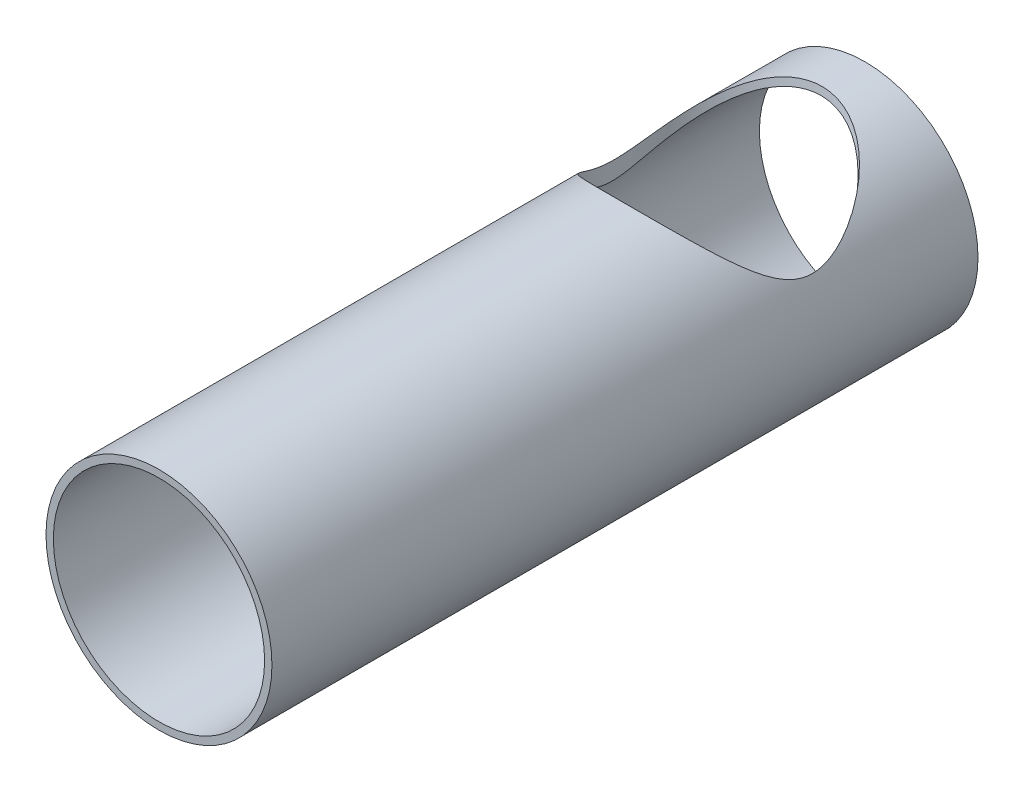
ISO-10303-21;
HEADER;
FILE_DESCRIPTION(('STEP AP214'),'2;1');
FILE_NAME('part.step','',(''),(''),'','','');
FILE_SCHEMA(('AUTOMOTIVE_DESIGN { 1 0 10303 214 1 1 1 1 }'));
ENDSEC;
DATA;
#1=APPLICATION_CONTEXT('core data for automotive mechanical design processes');
#2=APPLICATION_PROTOCOL_DEFINITION('international standard','automotive_design',2000,#1);
#3=PRODUCT_CONTEXT('',#1,'mechanical');
#4=PRODUCT('Part','Part','',(#3));
#5=PRODUCT_RELATED_PRODUCT_CATEGORY('part','',(#4));
#6=PRODUCT_DEFINITION_FORMATION('','',#4);
#7=PRODUCT_DEFINITION_CONTEXT('part definition',#1,'design');
#8=PRODUCT_DEFINITION('design','',#6,#7);
#9=PRODUCT_DEFINITION_SHAPE('','',#8);
#10=(LENGTH_UNIT() NAMED_UNIT(*) SI_UNIT(.MILLI.,.METRE.));
#11=(NAMED_UNIT(*) PLANE_ANGLE_UNIT() SI_UNIT($,.RADIAN.));
#12=(NAMED_UNIT(*) SI_UNIT($,.STERADIAN.) SOLID_ANGLE_UNIT());
#13=UNCERTAINTY_MEASURE_WITH_UNIT(LENGTH_MEASURE(1.E-05),#10,'distance_accuracy_value','');
#14=(GEOMETRIC_REPRESENTATION_CONTEXT(3) GLOBAL_UNCERTAINTY_ASSIGNED_CONTEXT((#13)) GLOBAL_UNIT_ASSIGNED_CONTEXT((#10,
#11,#12)) REPRESENTATION_CONTEXT('',''));
#15=CARTESIAN_POINT('',(0.,0.,0.));
#16=DIRECTION('',(0.,0.,1.));
#17=DIRECTION('',(1.,0.,0.));
#18=AXIS2_PLACEMENT_3D('',#15,#16,#17);
#19=CARTESIAN_POINT('',(0.,0.,158.75));
#20=DIRECTION('',(0.,0.,-1.));
#21=DIRECTION('',(-1.,0.,0.));
#22=AXIS2_PLACEMENT_3D('',#19,#20,#21);
#23=CYLINDRICAL_SURFACE('',#22,25.4);
#24=CARTESIAN_POINT('',(0.,0.,0.));
#25=DIRECTION('',(0.,0.,1.));
#26=DIRECTION('',(1.,0.,0.));
#27=AXIS2_PLACEMENT_3D('',#24,#25,#26);
#28=CIRCLE('',#27,25.4);
#29=CARTESIAN_POINT('',(25.4,0.,0.));
#30=VERTEX_POINT('',#29);
#31=EDGE_CURVE('E43',#30,#30,#28,.T.);
#32=ORIENTED_EDGE('',*,*,#31,.T.);
#33=EDGE_LOOP('',(#32));
#34=FACE_BOUND('',#33,.T.);
#35=CARTESIAN_POINT('',(0.,0.,158.75));
#36=DIRECTION('',(0.,0.,1.));
#37=DIRECTION('',(1.,0.,0.));
#38=AXIS2_PLACEMENT_3D('',#35,#36,#37);
#39=CIRCLE('',#38,25.4);
#40=CARTESIAN_POINT('',(25.4,0.,158.75));
#41=VERTEX_POINT('',#40);
#42=EDGE_CURVE('E10',#41,#41,#39,.T.);
#43=ORIENTED_EDGE('',*,*,#42,.F.);
#44=EDGE_LOOP('',(#43));
#45=FACE_BOUND('',#44,.T.);
#46=CARTESIAN_POINT('',(0.,25.4,54.5744532514627));
#47=CARTESIAN_POINT('',(0.543044109101492,25.3999985133409,54.5744519809982));
#48=CARTESIAN_POINT('',(1.08610934257235,25.3825532916884,54.5569065396016));
#49=CARTESIAN_POINT('',(2.16777710877893,25.3131291967407,54.4870082437825));
#50=CARTESIAN_POINT('',(2.70637939730243,25.2611484461329,54.434653497165));
#51=CARTESIAN_POINT('',(3.77507043033819,25.1236787183286,54.2959414756275));
#52=CARTESIAN_POINT('',(4.30515542950266,25.0381753983664,54.20956964629));
#53=CARTESIAN_POINT('',(5.35270281553756,24.8353223145373,54.0041222177252));
#54=CARTESIAN_POINT('',(5.87016521587325,24.7179725846446,53.8850466533866));
#55=CARTESIAN_POINT('',(6.88663391169063,24.4542155125313,53.6164904050943));
#56=CARTESIAN_POINT('',(7.38571804531323,24.3079529810863,53.4671611585642));
#57=CARTESIAN_POINT('',(8.36535843216009,23.9884608588766,53.1395592621605));
#58=CARTESIAN_POINT('',(8.84591471316594,23.8152313085496,52.9612866556882));
#59=CARTESIAN_POINT('',(9.78628178414864,23.4444899527841,52.5777132945053));
#60=CARTESIAN_POINT('',(10.2460956978944,23.2469818204638,52.3724166279455));
#61=CARTESIAN_POINT('',(11.143489004118,22.8304059775863,51.9365916911342));
#62=CARTESIAN_POINT('',(11.5810652465446,22.6113352254379,51.706059860732));
#63=CARTESIAN_POINT('',(12.4684379701758,22.1353186210106,51.2011863446624));
#64=CARTESIAN_POINT('',(12.9161881286465,21.8767372938388,50.924792498912));
#65=CARTESIAN_POINT('',(13.7831165418681,21.3411655950838,50.3462908457317));
#66=CARTESIAN_POINT('',(14.2022932095722,21.0641742026422,50.0441816120938));
#67=CARTESIAN_POINT('',(15.0119876406164,20.4950100389392,49.4153434994483));
#68=CARTESIAN_POINT('',(15.4024646851071,20.2028166654257,49.0885809245727));
#69=CARTESIAN_POINT('',(16.1537378938829,19.6073086647606,48.4118729915013));
#70=CARTESIAN_POINT('',(16.5145312828302,19.3039930015305,48.0619254710881));
#71=CARTESIAN_POINT('',(17.2766383683602,18.627599270138,47.265796824965));
#72=CARTESIAN_POINT('',(17.6712242140263,18.2529019422212,46.8145383992333));
#73=CARTESIAN_POINT('',(18.4166112361073,17.5005333109247,45.8789562213728));
#74=CARTESIAN_POINT('',(18.7673939472977,17.1228608242066,45.3946186569199));
#75=CARTESIAN_POINT('',(19.2596376098131,16.5616542656886,44.64267892329));
#76=CARTESIAN_POINT('',(19.4179985242925,16.3755537339444,44.3879168223579));
#77=CARTESIAN_POINT('',(19.7233218961993,16.0064943136974,43.8694616832648));
#78=CARTESIAN_POINT('',(19.8702857239152,15.8235350495814,43.6057697242479));
#79=CARTESIAN_POINT('',(20.1524655829059,15.4625541571574,43.0692310549454));
#80=CARTESIAN_POINT('',(20.2876906381353,15.284528808968,42.7963916043501));
#81=CARTESIAN_POINT('',(20.5461987853985,14.9352242434897,42.2408295575968));
#82=CARTESIAN_POINT('',(20.66948036001,14.7639458850438,41.9581057118174));
#83=CARTESIAN_POINT('',(20.9094497194313,14.4222267731328,41.3679719009154));
#84=CARTESIAN_POINT('',(21.025505462248,14.252250545377,41.0600333553242));
#85=CARTESIAN_POINT('',(21.2432210111938,13.9256621225521,40.4322923641351));
#86=CARTESIAN_POINT('',(21.3448857139376,13.7690453890992,40.1124940008583));
#87=CARTESIAN_POINT('',(21.5328290768842,13.4732301104542,39.4612908574595));
#88=CARTESIAN_POINT('',(21.6191376415331,13.3339978721466,39.1299101732045));
#89=CARTESIAN_POINT('',(21.7756153718284,13.0768978130998,38.4552099674225));
#90=CARTESIAN_POINT('',(21.8457873004516,12.9590263356227,38.1118925013637));
#91=CARTESIAN_POINT('',(21.9600634904851,12.7642654197161,37.4649018836385));
#92=CARTESIAN_POINT('',(22.0064705700553,12.6839137730788,37.1626815747364));
#93=CARTESIAN_POINT('',(22.086189864736,12.5445878830835,36.5516410210607));
#94=CARTESIAN_POINT('',(22.1195036757322,12.485611034506,36.2428215854689));
#95=CARTESIAN_POINT('',(22.1726679039566,12.3909549808955,35.6207289920115));
#96=CARTESIAN_POINT('',(22.1925295444454,12.3552563555704,35.3074597700087));
#97=CARTESIAN_POINT('',(22.2187884652799,12.3079719974785,34.6785413426079));
#98=CARTESIAN_POINT('',(22.2251854740243,12.2963867511137,34.3628920893302));
#99=CARTESIAN_POINT('',(22.2248067805522,12.2970714959609,33.7323981574621));
#100=CARTESIAN_POINT('',(22.218062469653,12.3092846387918,33.4175533560208));
#101=CARTESIAN_POINT('',(22.1920571988063,12.3561014531808,32.7901321517456));
#102=CARTESIAN_POINT('',(22.1727959141004,12.390705705686,32.4775558079806));
#103=CARTESIAN_POINT('',(22.0972878640051,12.5252064891459,31.5449466108873));
#104=CARTESIAN_POINT('',(22.0233197961139,12.6557837229783,30.9306192152068));
#105=CARTESIAN_POINT('',(21.8464040422192,12.958431158362,29.7999150513748));
#106=CARTESIAN_POINT('',(21.7481289962745,13.1234392546633,29.2807722398914));
#107=CARTESIAN_POINT('',(21.5237887538079,13.4882336413847,28.2607267321913));
#108=CARTESIAN_POINT('',(21.3977012476416,13.6880478241416,27.7598390572435));
#109=CARTESIAN_POINT('',(21.1196532288719,14.1132933198003,26.7741335701296));
#110=CARTESIAN_POINT('',(20.9675905114746,14.3388246094617,26.2893886417198));
#111=CARTESIAN_POINT('',(20.639472055829,14.8072273453193,25.336892422366));
#112=CARTESIAN_POINT('',(20.4634203625306,15.0500958648831,24.8691382832909));
#113=CARTESIAN_POINT('',(20.1185531463052,15.50716096383,24.0240624517841));
#114=CARTESIAN_POINT('',(19.95319320518,15.7196209815872,23.6443757023676));
#115=CARTESIAN_POINT('',(19.6063680950472,16.1501312884571,22.8956172240495));
#116=CARTESIAN_POINT('',(19.4249011394183,16.3681821958097,22.5265466787448));
#117=CARTESIAN_POINT('',(19.045802306339,16.8077876685647,21.7985894390365));
#118=CARTESIAN_POINT('',(18.8481607381445,17.0293442692734,21.4397090258778));
#119=CARTESIAN_POINT('',(18.4367199643381,17.4739551527015,20.7323164468985));
#120=CARTESIAN_POINT('',(18.2229214222974,17.6970093735708,20.3838038560871));
#121=CARTESIAN_POINT('',(17.7793210514847,18.1426130735272,19.6978168221308));
#122=CARTESIAN_POINT('',(17.5495462289052,18.3651627779138,19.3603251038003));
#123=CARTESIAN_POINT('',(17.0734426227854,18.808600052613,18.6961413289575));
#124=CARTESIAN_POINT('',(16.8271132985773,19.0294875683764,18.3694496256925));
#125=CARTESIAN_POINT('',(16.0630849584716,19.6872709104753,17.4066362184284));
#126=CARTESIAN_POINT('',(15.5199546530911,20.1196864592244,16.7871684238366));
#127=CARTESIAN_POINT('',(14.5506602536087,20.8248047310517,15.7917426099199));
#128=CARTESIAN_POINT('',(14.14342022497,21.1039607982689,15.4017861284279));
#129=CARTESIAN_POINT('',(13.2960687969311,21.647816266799,14.6482330299898));
#130=CARTESIAN_POINT('',(12.8559584078737,21.9125161120231,14.2846356035167));
#131=CARTESIAN_POINT('',(11.9430430242255,22.4231301427247,13.5878258417028));
#132=CARTESIAN_POINT('',(11.4702862458649,22.6690709491972,13.2545703128489));
#133=CARTESIAN_POINT('',(10.7365705423674,23.0208520057648,12.7803924878756));
#134=CARTESIAN_POINT('',(10.4879169395252,23.1352512264899,12.6266255874509));
#135=CARTESIAN_POINT('',(9.98239671784103,23.3578263095845,12.3281759883536));
#136=CARTESIAN_POINT('',(9.72552802674836,23.4660005821416,12.1834956094664));
#137=CARTESIAN_POINT('',(9.05239290159765,23.7362900397444,11.8227616069926));
#138=CARTESIAN_POINT('',(8.63010514935204,23.8932914514503,11.613995028399));
#139=CARTESIAN_POINT('',(7.76671168631038,24.1877276483544,11.2235325844231));
#140=CARTESIAN_POINT('',(7.32561046670562,24.3251670698298,11.0418303042076));
#141=CARTESIAN_POINT('',(6.42628857995993,24.5780564710631,10.7082068669175));
#142=CARTESIAN_POINT('',(5.96807405267292,24.6935142483669,10.5562751487743));
#143=CARTESIAN_POINT('',(5.03676063276929,24.9001709700819,10.2847674421281));
#144=CARTESIAN_POINT('',(4.56366162856524,24.9913697325772,10.165191696259));
#145=CARTESIAN_POINT('',(3.60201594349586,25.148053108814,9.95997935334493));
#146=CARTESIAN_POINT('',(3.11337838612121,25.2133343847403,9.87461108726974));
#147=CARTESIAN_POINT('',(2.12808212586151,25.3155394568779,9.74103825322522));
#148=CARTESIAN_POINT('',(1.63142342933742,25.3524632755762,9.69283365578566));
#149=CARTESIAN_POINT('',(0.634764506059803,25.3969642331556,9.63474414150607));
#150=CARTESIAN_POINT('',(0.134765813700097,25.4045540286391,9.62484269819634));
#151=CARTESIAN_POINT('',(-0.864057614116663,25.3902107949007,9.64356104284659));
#152=CARTESIAN_POINT('',(-1.36288244322217,25.3682802066734,9.67217764580911));
#153=CARTESIAN_POINT('',(-2.29584239228957,25.2998278833669,9.7615738169229));
#154=CARTESIAN_POINT('',(-2.73063026863405,25.2565327949571,9.81813416471003));
#155=CARTESIAN_POINT('',(-3.59278429644191,25.1483720084925,9.95958621673193));
#156=CARTESIAN_POINT('',(-4.02015132202326,25.0835088693714,10.044474560006));
#157=CARTESIAN_POINT('',(-4.86509386553497,24.9334124472918,10.2411944707491));
#158=CARTESIAN_POINT('',(-5.28266644848754,24.8481731419773,10.3530340039598));
#159=CARTESIAN_POINT('',(-6.10584569192517,24.6588141553051,10.6019419870374));
#160=CARTESIAN_POINT('',(-6.51145051562039,24.5546915931248,10.7390142864538));
#161=CARTESIAN_POINT('',(-7.42999004671811,24.2949958391243,11.0816569868399));
#162=CARTESIAN_POINT('',(-7.93819037558545,24.1333939393902,11.2953960350314));
#163=CARTESIAN_POINT('',(-8.92898350943746,23.7846448899273,11.7583813662733));
#164=CARTESIAN_POINT('',(-9.41156972811312,23.5974912136883,12.0076367217161));
#165=CARTESIAN_POINT('',(-10.3502032646524,23.2011447548612,12.5379042155183));
#166=CARTESIAN_POINT('',(-10.806219551745,22.9919269742236,12.8189524010765));
#167=CARTESIAN_POINT('',(-11.6904963469218,22.5551670470545,13.4088967243669));
#168=CARTESIAN_POINT('',(-12.1187556136495,22.3276240819986,13.7177941061031));
#169=CARTESIAN_POINT('',(-13.1079144340971,21.7664693843439,14.4846106235249));
#170=CARTESIAN_POINT('',(-13.6560323119843,21.4258785880241,14.9539499254836));
#171=CARTESIAN_POINT('',(-14.6999923849455,20.7235681885272,15.9332888190547));
#172=CARTESIAN_POINT('',(-15.1958119458157,20.3618395414845,16.4433058492616));
#173=CARTESIAN_POINT('',(-16.1380939931243,19.6234870385506,17.5004590118192));
#174=CARTESIAN_POINT('',(-16.5843989392593,19.246820539587,18.0477051622061));
#175=CARTESIAN_POINT('',(-17.4275344637445,18.4868300438486,19.1744607972631));
#176=CARTESIAN_POINT('',(-17.8243754798928,18.1035074711447,19.7539634377581));
#177=CARTESIAN_POINT('',(-18.3904836741568,17.5221853195764,20.6571671099847));
#178=CARTESIAN_POINT('',(-18.5773498730643,17.3237912972825,20.9697356951699));
#179=CARTESIAN_POINT('',(-18.9382785933248,16.9284731647894,21.6030769429005));
#180=CARTESIAN_POINT('',(-19.1123420398755,16.7315489492998,21.9238490103545));
#181=CARTESIAN_POINT('',(-19.4478479761567,16.3403688354652,22.5738923159288));
#182=CARTESIAN_POINT('',(-19.6092812646556,16.1461149658776,22.9031695220908));
#183=CARTESIAN_POINT('',(-19.9193466196245,15.7619965043624,23.5701617446058));
#184=CARTESIAN_POINT('',(-20.0679800109883,15.5721314596475,23.9078758829878));
#185=CARTESIAN_POINT('',(-20.3517904044661,15.199318951495,24.5907988387063));
#186=CARTESIAN_POINT('',(-20.4870158693528,15.0163481763957,24.9359747275475));
#187=CARTESIAN_POINT('',(-20.7443741011935,14.6587673432601,25.6354918344236));
#188=CARTESIAN_POINT('',(-20.8665056513535,14.4841580630753,25.9898339004636));
#189=CARTESIAN_POINT('',(-21.0970514756215,14.1462431449348,26.7076937664854));
#190=CARTESIAN_POINT('',(-21.2054825563352,13.9829237711194,27.0711996549835));
#191=CARTESIAN_POINT('',(-21.4080739884232,13.6707341904665,27.8081953619517));
#192=CARTESIAN_POINT('',(-21.5022384963045,13.5218597797114,28.1816822350537));
#193=CARTESIAN_POINT('',(-21.6641490990182,13.260661093013,28.8901327498406));
#194=CARTESIAN_POINT('',(-21.7337363771909,13.1460994455804,29.2238452310946));
#195=CARTESIAN_POINT('',(-21.8604713623745,12.9342581368929,29.8990679702559));
#196=CARTESIAN_POINT('',(-21.9176201260037,12.8369770078338,30.2405775630943));
#197=CARTESIAN_POINT('',(-22.0183088459535,12.6634964248591,30.9301673439727));
#198=CARTESIAN_POINT('',(-22.061877752856,12.5872521633453,31.2782318531812));
#199=CARTESIAN_POINT('',(-22.1343623723204,12.459351575459,31.9803286203106));
#200=CARTESIAN_POINT('',(-22.163282743244,12.4076874327128,32.3343589439983));
#201=CARTESIAN_POINT('',(-22.2056004457006,12.3317993539022,33.051676723974));
#202=CARTESIAN_POINT('',(-22.218761854906,12.307992578141,33.4150236504359));
#203=CARTESIAN_POINT('',(-22.227747685047,12.291759243948,34.1426457151774));
#204=CARTESIAN_POINT('',(-22.2235742373034,12.2993288277924,34.5069207338445));
#205=CARTESIAN_POINT('',(-22.1973385583207,12.3466141731277,35.232720287149));
#206=CARTESIAN_POINT('',(-22.1752771975236,12.3863283704328,35.5942449547569));
#207=CARTESIAN_POINT('',(-22.1133105212758,12.496617553648,36.3109962715274));
#208=CARTESIAN_POINT('',(-22.073402735049,12.5671968126899,36.6662220415472));
#209=CARTESIAN_POINT('',(-21.9726650936708,12.7425632726323,37.3938536035468));
#210=CARTESIAN_POINT('',(-21.9104884706517,12.8495223723374,37.7655446816152));
#211=CARTESIAN_POINT('',(-21.7672827266615,13.0906453839686,38.4961751526553));
#212=CARTESIAN_POINT('',(-21.6862504655382,13.224813826765,38.8551124101606));
#213=CARTESIAN_POINT('',(-21.5062925097408,13.5154971554905,39.5604022446609));
#214=CARTESIAN_POINT('',(-21.4073136067639,13.6720781916246,39.9067136192423));
#215=CARTESIAN_POINT('',(-21.1926993601837,14.0024388812057,40.5857997977569));
#216=CARTESIAN_POINT('',(-21.0770571935541,14.1762255706026,40.9185689847062));
#217=CARTESIAN_POINT('',(-20.8515451637962,14.5053667614965,41.5142058279903));
#218=CARTESIAN_POINT('',(-20.7441684941635,14.65867129823,41.7791662331454));
#219=CARTESIAN_POINT('',(-20.5191225109583,14.972069755784,42.3004393370809));
#220=CARTESIAN_POINT('',(-20.4014554210484,15.1321622059673,42.5567538876419));
#221=CARTESIAN_POINT('',(-20.033304937109,15.6202574112821,43.313778444452));
#222=CARTESIAN_POINT('',(-19.7677708742601,15.9559316606396,43.8023115635553));
#223=CARTESIAN_POINT('',(-19.1981305759491,16.6369897357274,44.7498738246309));
#224=CARTESIAN_POINT('',(-18.8939833773736,16.9823835651841,45.208870842127));
#225=CARTESIAN_POINT('',(-18.2482724528272,17.6744026663581,46.0985210198148));
#226=CARTESIAN_POINT('',(-17.9067169332308,18.0210276519137,46.5291803634745));
#227=CARTESIAN_POINT('',(-17.1641948293852,18.7304636547353,47.3889100472362));
#228=CARTESIAN_POINT('',(-16.7608527303948,19.0929378996141,47.8162102672186));
#229=CARTESIAN_POINT('',(-15.9128533707078,19.8052488149302,48.6393490216337));
#230=CARTESIAN_POINT('',(-15.4681909234039,20.1550838912007,49.035183594838));
#231=CARTESIAN_POINT('',(-14.5386438392314,20.835523184839,49.7934599638693));
#232=CARTESIAN_POINT('',(-14.0538129860401,21.1661521400631,50.155945082511));
#233=CARTESIAN_POINT('',(-13.2970020555387,21.6434462570343,50.6731329493436));
#234=CARTESIAN_POINT('',(-13.0398186734882,21.7994283275561,50.8410974292317));
#235=CARTESIAN_POINT('',(-12.5156492295034,22.1045357333448,51.1679078907936));
#236=CARTESIAN_POINT('',(-12.2486606650424,22.2536592959672,51.3267515177054));
#237=CARTESIAN_POINT('',(-11.5243152725585,22.6409680694066,51.7373971129149));
#238=CARTESIAN_POINT('',(-11.0584711954724,22.8724074859403,51.9807440149779));
#239=CARTESIAN_POINT('',(-10.1019100737994,23.3106875223425,52.4387985077442));
#240=CARTESIAN_POINT('',(-9.61119782786746,23.5175328623933,52.6535115949157));
#241=CARTESIAN_POINT('',(-8.60711429907272,23.9032758972832,53.0520312678652));
#242=CARTESIAN_POINT('',(-8.0937577727695,24.0821914578191,53.2358576165949));
#243=CARTESIAN_POINT('',(-7.04680748349157,24.4090787229339,53.5705044876947));
#244=CARTESIAN_POINT('',(-6.51321570566251,24.5570534536818,53.7213282379521));
#245=CARTESIAN_POINT('',(-5.49183495177182,24.8040940921653,53.9724657087673));
#246=CARTESIAN_POINT('',(-5.00587132336027,24.9068344398914,54.0766007694567));
#247=CARTESIAN_POINT('',(-4.02362549642344,25.084246636578,54.2561266326335));
#248=CARTESIAN_POINT('',(-3.52734425502646,25.1589210769603,54.3315200889413));
#249=CARTESIAN_POINT('',(-2.52772351495088,25.27892338877,54.4525612028737));
#250=CARTESIAN_POINT('',(-2.02438521343061,25.3242561776156,54.4982138448214));
#251=CARTESIAN_POINT('',(-1.01403756814099,25.384796140519,54.5591614328969));
#252=CARTESIAN_POINT('',(-0.507027991691095,25.40000138806,54.5744544376667));
#253=CARTESIAN_POINT('',(0.,25.4,54.5744532514627));
#254=B_SPLINE_CURVE_WITH_KNOTS('',3,(#46,#47,#48,#49,#50,#51,#52,#53,#54,#55,#56,#57,#58,#59,
#60,#61,#62,#63,#64,#65,#66,#67,#68,#69,#70,#71,#72,#73,#74,#75,#76,#77,#78,#79,#80,#81,#82,#83,
#84,#85,#86,#87,#88,#89,#90,#91,#92,#93,#94,#95,#96,#97,#98,#99,#100,#101,#102,#103,#104,#105,
#106,#107,#108,#109,#110,#111,#112,#113,#114,#115,#116,#117,#118,#119,#120,#121,#122,#123,#124,
#125,#126,#127,#128,#129,#130,#131,#132,#133,#134,#135,#136,#137,#138,#139,#140,#141,#142,#143,
#144,#145,#146,#147,#148,#149,#150,#151,#152,#153,#154,#155,#156,#157,#158,#159,#160,#161,#162,
#163,#164,#165,#166,#167,#168,#169,#170,#171,#172,#173,#174,#175,#176,#177,#178,#179,#180,#181,
#182,#183,#184,#185,#186,#187,#188,#189,#190,#191,#192,#193,#194,#195,#196,#197,#198,#199,#200,
#201,#202,#203,#204,#205,#206,#207,#208,#209,#210,#211,#212,#213,#214,#215,#216,#217,#218,#219,
#220,#221,#222,#223,#224,#225,#226,#227,#228,#229,#230,#231,#232,#233,#234,#235,#236,#237,#238,
#239,#240,#241,#242,#243,#244,#245,#246,#247,#248,#249,#250,#251,#252,#253),.UNSPECIFIED.,.T.,
.F.,(4,2,2,2,2,2,2,2,2,2,2,2,2,2,2,2,2,2,2,2,2,2,2,2,2,2,2,2,2,2,2,2,2,2,2,2,2,2,2,2,2,2,2,2,2,
2,2,2,2,2,2,2,2,2,2,2,2,2,2,2,2,2,2,2,2,2,2,2,2,2,2,2,2,2,2,2,2,2,2,2,2,2,2,2,2,2,2,2,2,2,2,2,2,
2,2,2,2,2,2,2,2,2,2,4),(0.,1.62861062854495,3.25730979377955,4.88670656629134,6.51610160055492,
8.13753358774625,9.75896314358753,11.3801476937962,13.0015612545217,14.7587836144232,
16.5161034956823,18.2758703575628,20.0358015661335,22.1544156462229,24.2739198351785,
25.3326955717112,26.3913438120725,27.4491708940349,28.5071321974304,29.6176637396272,
30.7278165056079,31.8357831231135,32.9435598888223,33.8910234915432,34.8383715759118,
35.7849283028566,36.731504123045,37.6758215827907,38.6201635442461,40.5105850688647,
42.1689223241295,43.828594676383,45.494954463433,47.1610336207269,48.5569558333083,
49.9530330782401,51.3499529701621,52.7468155213487,54.1413716857648,55.5359734183418,
58.3227083607754,60.2088525996232,62.0949388875284,63.9782968065363,64.91986712939,
65.8616768657316,67.3498636205337,68.8376970791496,70.3250017713854,71.8123176164525,
73.3110820473291,74.8098452897068,76.3079617960572,77.8059544330886,79.12620158787,
80.4462921582508,81.7667733765212,83.0874562166405,84.8084695689199,86.5299233327901,
88.25334884914,89.9768513878652,92.3671196794362,94.7584182475855,97.1571192846517,
99.5553132916913,100.799191782616,102.042980295501,103.287666646306,104.532224006665,
105.77210505206,107.012101217691,108.250561177121,109.488659619618,110.566926504807,
111.645101758349,112.720962499911,113.796480893263,114.887906887535,115.979198694952,
117.070437402321,118.161827234731,119.335224373524,120.508817065811,121.685947883976,
122.863562073157,123.836394691955,124.809017607806,126.755197344824,128.703459232914,
130.65129457784,132.720466363514,134.78989822723,136.856602659857,137.889845693379,
138.923354294379,140.644388380239,142.365091624142,144.084689644307,145.80411940038,
147.325014447269,148.845769030178,150.366268681155,151.886865557906),.UNSPECIFIED.);
#255=CARTESIAN_POINT('',(0.,25.4,54.5744532514627));
#256=VERTEX_POINT('',#255);
#257=EDGE_CURVE('E53',#256,#256,#254,.T.);
#258=ORIENTED_EDGE('',*,*,#257,.F.);
#259=EDGE_LOOP('',(#258));
#260=FACE_BOUND('',#259,.T.);
#261=ADVANCED_FACE('F31',(#34,#45,#260),#23,.T.);
#262=CARTESIAN_POINT('',(0.,0.,158.75));
#263=DIRECTION('',(0.,0.,-1.));
#264=DIRECTION('',(-1.,0.,0.));
#265=AXIS2_PLACEMENT_3D('',#262,#263,#264);
#266=CYLINDRICAL_SURFACE('',#265,23.749);
#267=CARTESIAN_POINT('',(0.,0.,0.));
#268=DIRECTION('',(0.,0.,1.));
#269=DIRECTION('',(1.,0.,0.));
#270=AXIS2_PLACEMENT_3D('',#267,#268,#269);
#271=CIRCLE('',#270,23.749);
#272=CARTESIAN_POINT('',(23.749,0.,0.));
#273=VERTEX_POINT('',#272);
#274=EDGE_CURVE('E50',#273,#273,#271,.T.);
#275=ORIENTED_EDGE('',*,*,#274,.F.);
#276=EDGE_LOOP('',(#275));
#277=FACE_BOUND('',#276,.T.);
#278=CARTESIAN_POINT('',(0.,0.,158.75));
#279=DIRECTION('',(0.,0.,1.));
#280=DIRECTION('',(1.,0.,0.));
#281=AXIS2_PLACEMENT_3D('',#278,#279,#280);
#282=CIRCLE('',#281,23.749);
#283=CARTESIAN_POINT('',(23.749,0.,158.75));
#284=VERTEX_POINT('',#283);
#285=EDGE_CURVE('E48',#284,#284,#282,.T.);
#286=ORIENTED_EDGE('',*,*,#285,.T.);
#287=EDGE_LOOP('',(#286));
#288=FACE_BOUND('',#287,.T.);
#289=CARTESIAN_POINT('',(0.,23.749,54.8211968546902));
#290=CARTESIAN_POINT('',(0.53021007984836,23.748994705601,54.8211923111917));
#291=CARTESIAN_POINT('',(1.06052315771295,23.7312088483774,54.8046366624558));
#292=CARTESIAN_POINT('',(2.11680620906524,23.6603999255772,54.7386897719219));
#293=CARTESIAN_POINT('',(2.64277500753166,23.607367623545,54.6892899231838));
#294=CARTESIAN_POINT('',(3.68660527138023,23.4670304025225,54.5584429184084));
#295=CARTESIAN_POINT('',(4.20445821500657,23.3796916803439,54.4769641538281));
#296=CARTESIAN_POINT('',(5.22766838732209,23.1723758543429,54.2833005144163));
#297=CARTESIAN_POINT('',(5.73302620348286,23.0524002881715,54.1711170862016));
#298=CARTESIAN_POINT('',(6.7252671994136,22.7826402057908,53.9184336416083));
#299=CARTESIAN_POINT('',(7.21223649090623,22.6330227581909,53.7780922759844));
#300=CARTESIAN_POINT('',(8.16795855281011,22.3059314398901,53.4706012623));
#301=CARTESIAN_POINT('',(8.63671150502017,22.1284578472822,53.3034518818685));
#302=CARTESIAN_POINT('',(9.55393654837515,21.7481911531364,52.9443262512442));
#303=CARTESIAN_POINT('',(10.0024085546696,21.5453979456809,52.7523498971945));
#304=CARTESIAN_POINT('',(10.8776542479067,21.1170326152692,52.3454784096119));
#305=CARTESIAN_POINT('',(11.3044235660449,20.8914559330202,52.1305786883068));
#306=CARTESIAN_POINT('',(11.9966864649118,20.4986820667935,51.7548765287212));
#307=CARTESIAN_POINT('',(12.268555416438,20.3370625366732,51.5998936396019));
#308=CARTESIAN_POINT('',(12.801842073082,20.0056589099073,51.2811310013586));
#309=CARTESIAN_POINT('',(13.0632620415114,19.8358765991126,51.1173531754797));
#310=CARTESIAN_POINT('',(13.831868034904,19.3152106860692,50.6133706593922));
#311=CARTESIAN_POINT('',(14.3233091596613,18.9530601431299,50.2605665622092));
#312=CARTESIAN_POINT('',(15.2641544544645,18.2039311662083,49.5240907740524));
#313=CARTESIAN_POINT('',(15.7134687051063,17.8169024685244,49.1403561672214));
#314=CARTESIAN_POINT('',(16.5688459989055,17.0243397798191,48.3450545696463));
#315=CARTESIAN_POINT('',(16.9749147390966,16.6188082363865,47.9334912566804));
#316=CARTESIAN_POINT('',(17.750370154637,15.7882076779276,47.0768742949858));
#317=CARTESIAN_POINT('',(18.1190408603007,15.3629266805062,46.6313800388798));
#318=CARTESIAN_POINT('',(18.8123412826634,14.5056691485067,45.7129184629754));
#319=CARTESIAN_POINT('',(19.136956132489,14.0736904082639,45.2399419456621));
#320=CARTESIAN_POINT('',(19.5903481178726,13.4276754977008,44.5092662237984));
#321=CARTESIAN_POINT('',(19.7357633587387,13.2128737712147,44.2624265428765));
#322=CARTESIAN_POINT('',(20.0155331246726,12.7850959939256,43.761032765435));
#323=CARTESIAN_POINT('',(20.1498887600945,12.5721197617761,43.5064794468629));
#324=CARTESIAN_POINT('',(20.4073635952684,12.1497184668012,42.9891791921824));
#325=CARTESIAN_POINT('',(20.5304897157575,11.9402912823986,42.7264374384205));
#326=CARTESIAN_POINT('',(20.7653995551364,11.5269099433341,42.1917866166461));
#327=CARTESIAN_POINT('',(20.8771853585146,11.3229547879345,41.919879245672));
#328=CARTESIAN_POINT('',(21.0739508986839,10.9517666413858,41.4054492933888));
#329=CARTESIAN_POINT('',(21.1604767550122,10.7834582332182,41.1642964934598));
#330=CARTESIAN_POINT('',(21.3247096744676,10.4549253698792,40.6735920105703));
#331=CARTESIAN_POINT('',(21.4024169769874,10.2947006953287,40.4240405558422));
#332=CARTESIAN_POINT('',(21.5485849375838,9.98512767032478,39.9157228390168));
#333=CARTESIAN_POINT('',(21.6170486370992,9.83577574987999,39.6569596434607));
#334=CARTESIAN_POINT('',(21.7442013834789,9.55138496819162,39.1293079572441));
#335=CARTESIAN_POINT('',(21.8028918665463,9.41634400497298,38.8604209614393));
#336=CARTESIAN_POINT('',(21.90035170548,9.18707163190094,38.3604157383891));
#337=CARTESIAN_POINT('',(21.9408087993526,9.08984416868405,38.1310077830591));
#338=CARTESIAN_POINT('',(22.0141409514288,8.91077794311595,37.6651077819331));
#339=CARTESIAN_POINT('',(22.0470186203126,8.82893388385747,37.4286182071596));
#340=CARTESIAN_POINT('',(22.1046620368184,8.68360730995422,36.9497301856252));
#341=CARTESIAN_POINT('',(22.1294490520388,8.62007670769658,36.7073490598288));
#342=CARTESIAN_POINT('',(22.170642761928,8.51357057892876,36.2173848973792));
#343=CARTESIAN_POINT('',(22.1870501872266,8.47059326036558,35.9698023162098));
#344=CARTESIAN_POINT('',(22.211380536018,8.40659115065819,35.4695347474468));
#345=CARTESIAN_POINT('',(22.2192405501345,8.38572915729156,35.2168256892545));
#346=CARTESIAN_POINT('',(22.226341881813,8.36688873618688,34.7104481662032));
#347=CARTESIAN_POINT('',(22.2255830343838,8.36891074651879,34.4567796830709));
#348=CARTESIAN_POINT('',(22.2157997650607,8.39484476392205,33.9502785282672));
#349=CARTESIAN_POINT('',(22.2067594165256,8.41879895000307,33.6974484095317));
#350=CARTESIAN_POINT('',(22.1809484123395,8.48656699672332,33.1948284451992));
#351=CARTESIAN_POINT('',(22.1641743330174,8.5303896528585,32.9450399964495));
#352=CARTESIAN_POINT('',(22.1145264813462,8.65848091310628,32.3400667980153));
#353=CARTESIAN_POINT('',(22.0778128320473,8.75206640645585,31.987175807637));
#354=CARTESIAN_POINT('',(21.9913806987613,8.9670245853789,31.2916391983051));
#355=CARTESIAN_POINT('',(21.9416538663828,9.08841510254543,30.9490003142348));
#356=CARTESIAN_POINT('',(21.8303871968752,9.3525291630488,30.2726878955692));
#357=CARTESIAN_POINT('',(21.7688054742591,9.49532793764846,29.9390510799555));
#358=CARTESIAN_POINT('',(21.6349362489411,9.79651511696844,29.2812629305053));
#359=CARTESIAN_POINT('',(21.5626505296372,9.95490092325437,28.9571100273031));
#360=CARTESIAN_POINT('',(21.3974357099864,10.305691489598,28.2734663493122));
#361=CARTESIAN_POINT('',(21.3030354178617,10.4997865120626,27.9152045370527));
#362=CARTESIAN_POINT('',(21.1017810784473,10.898613943963,27.2081692469067));
#363=CARTESIAN_POINT('',(20.9949240275052,11.1033489123469,26.8593980825747));
#364=CARTESIAN_POINT('',(20.7689749044168,11.5204604503662,26.1700628896925));
#365=CARTESIAN_POINT('',(20.6498719946821,11.7328436788298,25.8295064659892));
#366=CARTESIAN_POINT('',(20.3996458519319,12.1627016918556,25.1561712913486));
#367=CARTESIAN_POINT('',(20.2685236207525,12.3801760509382,24.823391895076));
#368=CARTESIAN_POINT('',(19.9939545397583,12.8188885495127,24.1643358207238));
#369=CARTESIAN_POINT('',(19.8504817888601,13.0401337780858,23.8380746680121));
#370=CARTESIAN_POINT('',(19.5513519807917,13.4844868525382,23.1924373855758));
#371=CARTESIAN_POINT('',(19.39569391827,13.7075948507463,22.8730618267267));
#372=CARTESIAN_POINT('',(19.0721170451233,14.1543419759323,22.2412097009862));
#373=CARTESIAN_POINT('',(18.9042037042416,14.3779808233836,21.9287301364183));
#374=CARTESIAN_POINT('',(18.5558473642235,14.8248371562298,21.3105266160795));
#375=CARTESIAN_POINT('',(18.3754043461652,15.0480546409878,21.0048026705117));
#376=CARTESIAN_POINT('',(17.9742962920444,15.5258081772311,20.3558450947427));
#377=CARTESIAN_POINT('',(17.7516157771023,15.7801300013867,20.0136956088764));
#378=CARTESIAN_POINT('',(17.2890157195756,16.2856484597111,19.3388564228981));
#379=CARTESIAN_POINT('',(17.0490958403588,16.5368450327409,19.0061669076876));
#380=CARTESIAN_POINT('',(16.5514202249407,17.0349485468721,18.3506944622004));
#381=CARTESIAN_POINT('',(16.2936564314958,17.2818534863418,18.0279161034261));
#382=CARTESIAN_POINT('',(15.7599238379483,17.7699367094368,17.3932640386084));
#383=CARTESIAN_POINT('',(15.4839526364873,18.0111142319509,17.0813917792931));
#384=CARTESIAN_POINT('',(14.6304072051999,18.7219851311339,16.1662658745651));
#385=CARTESIAN_POINT('',(14.0248496029594,19.181404743255,15.5803761593613));
#386=CARTESIAN_POINT('',(13.059007431869,19.8400869554886,14.7455774047698));
#387=CARTESIAN_POINT('',(12.7276125946776,20.0544974542211,14.4747450241605));
#388=CARTESIAN_POINT('',(12.045103961958,20.4716980049792,13.9491899817396));
#389=CARTESIAN_POINT('',(11.6939875952976,20.6744865348322,13.6944694297036));
#390=CARTESIAN_POINT('',(10.9489158164817,21.0790716321093,13.1874361086203));
#391=CARTESIAN_POINT('',(10.5536568127525,21.2799749327479,12.9363196809124));
#392=CARTESIAN_POINT('',(9.74114945147324,21.6639517943882,12.4573386733166));
#393=CARTESIAN_POINT('',(9.32390891977444,21.8470316356569,12.2294659019417));
#394=CARTESIAN_POINT('',(8.46808753442603,22.1927783797519,11.7998347772391));
#395=CARTESIAN_POINT('',(8.02951038109062,22.355448804702,11.5980719178437));
#396=CARTESIAN_POINT('',(7.13228184193091,22.6576610699021,11.2237244982958));
#397=CARTESIAN_POINT('',(6.67362972707321,22.7972020693118,11.0511409989164));
#398=CARTESIAN_POINT('',(5.73349145140594,23.0517169206428,10.7366749837254));
#399=CARTESIAN_POINT('',(5.25181611575129,23.1664174669464,10.5951338133465));
#400=CARTESIAN_POINT('',(4.27331545998076,23.3667091469737,10.3481509952112));
#401=CARTESIAN_POINT('',(3.77649024317108,23.4523004791431,10.2427091013557));
#402=CARTESIAN_POINT('',(2.77227074658836,23.5920799907131,10.0705876458318));
#403=CARTESIAN_POINT('',(2.26488699061177,23.6462980202842,10.0038712385592));
#404=CARTESIAN_POINT('',(1.24402156840189,23.7219145781051,9.91083920709698));
#405=CARTESIAN_POINT('',(0.730540855083022,23.7433181687293,9.88451735112738));
#406=CARTESIAN_POINT('',(-0.226868586106329,23.7520626597043,9.87376287000567));
#407=CARTESIAN_POINT('',(-0.670712629531231,23.743658801233,9.88409728966264));
#408=CARTESIAN_POINT('',(-1.55544758786171,23.7021441185053,9.93516272690657));
#409=CARTESIAN_POINT('',(-1.99633880895003,23.6690358971927,9.97589054213224));
#410=CARTESIAN_POINT('',(-2.87192687335298,23.5788211267989,10.0869183312692));
#411=CARTESIAN_POINT('',(-3.30662285876451,23.5217112867763,10.1572223604745));
#412=CARTESIAN_POINT('',(-4.16682077822799,23.3846597539157,10.3260480316658));
#413=CARTESIAN_POINT('',(-4.59232237547301,23.3047172261954,10.4245707054732));
#414=CARTESIAN_POINT('',(-5.42048261009636,23.1259177872663,10.6451162750907));
#415=CARTESIAN_POINT('',(-5.82344778697953,23.0276190473595,10.7664462343585));
#416=CARTESIAN_POINT('',(-6.61646538321276,22.812413285921,11.0323497651768));
#417=CARTESIAN_POINT('',(-7.00651847966124,22.6955072420136,11.1769221155807));
#418=CARTESIAN_POINT('',(-7.77241159587893,22.4447544965266,11.4874038262478));
#419=CARTESIAN_POINT('',(-8.14825095805157,22.3109070123958,11.6533141721518));
#420=CARTESIAN_POINT('',(-8.88483206806653,22.0279482576592,12.0045734102243));
#421=CARTESIAN_POINT('',(-9.24557038343324,21.8788335430609,12.1899266885755));
#422=CARTESIAN_POINT('',(-10.1424903684427,21.4825165571896,12.6834074200579));
#423=CARTESIAN_POINT('',(-10.6679037029222,21.2259219797402,13.0036694079306));
#424=CARTESIAN_POINT('',(-11.6806172731503,20.6859333172851,13.6799287062063));
#425=CARTESIAN_POINT('',(-12.1679004997972,20.4025273953789,14.0359418046188));
#426=CARTESIAN_POINT('',(-13.1057528636669,19.8131716754739,14.7794039551958));
#427=CARTESIAN_POINT('',(-13.5562201604465,19.5071635238542,15.166934658757));
#428=CARTESIAN_POINT('',(-14.4198837783632,18.8776982371476,15.9682727522304));
#429=CARTESIAN_POINT('',(-14.8330815261067,18.5542417707065,16.3820791353263));
#430=CARTESIAN_POINT('',(-15.5130777948402,17.9860277146127,17.1137867919115));
#431=CARTESIAN_POINT('',(-15.788545675609,17.7445061833918,17.4262147669543));
#432=CARTESIAN_POINT('',(-16.3212733918331,17.2557727220235,18.0619583462396));
#433=CARTESIAN_POINT('',(-16.5785331766611,17.0085607760565,18.3852739807513));
#434=CARTESIAN_POINT('',(-17.0754653894098,16.5096191351562,19.0421560634783));
#435=CARTESIAN_POINT('',(-17.3151275916748,16.257886917655,19.3757283144094));
#436=CARTESIAN_POINT('',(-17.7771672682381,15.7513437114451,20.0523343130343));
#437=CARTESIAN_POINT('',(-17.9995453129748,15.4965328246643,20.395367747969));
#438=CARTESIAN_POINT('',(-18.4272819812047,14.9853676634235,21.0902271128148));
#439=CARTESIAN_POINT('',(-18.632654147752,14.7290147949347,21.4420457500297));
#440=CARTESIAN_POINT('',(-19.0269518593269,14.2160034189051,22.1545614014715));
#441=CARTESIAN_POINT('',(-19.2158773348412,13.9593449100771,22.5152584532154));
#442=CARTESIAN_POINT('',(-19.5774793242315,13.4475061160127,23.2453872864104));
#443=CARTESIAN_POINT('',(-19.7501646849352,13.19232509785,23.6148141734049));
#444=CARTESIAN_POINT('',(-20.0795866517496,12.6852890213013,24.3628889505961));
#445=CARTESIAN_POINT('',(-20.2363250473341,12.4334335925035,24.7415358002605));
#446=CARTESIAN_POINT('',(-20.5196174573036,11.9594738424071,25.471840887026));
#447=CARTESIAN_POINT('',(-20.6476246835629,11.7368386068033,25.8225903784035));
#448=CARTESIAN_POINT('',(-20.8905934174167,11.2987087280806,26.5329708550297));
#449=CARTESIAN_POINT('',(-21.0055553113508,11.083213873632,26.892601576875));
#450=CARTESIAN_POINT('',(-21.2221938977927,10.6625259556565,27.6219368218896));
#451=CARTESIAN_POINT('',(-21.3238670701536,10.4573356306,27.9916439830631));
#452=CARTESIAN_POINT('',(-21.5133318071008,10.0617870694568,28.7423851475965));
#453=CARTESIAN_POINT('',(-21.6011258878384,9.87142614811729,29.1234170829647));
#454=CARTESIAN_POINT('',(-21.7412582385056,9.55793938119661,29.7991738120642));
#455=CARTESIAN_POINT('',(-21.7969162779572,9.43008717128684,30.090984817844));
#456=CARTESIAN_POINT('',(-21.8993758082301,9.18963522075014,30.6822420861929));
#457=CARTESIAN_POINT('',(-21.946176258649,9.07703727231223,30.9816892410136));
#458=CARTESIAN_POINT('',(-22.0717986457576,8.76925676964868,31.8909673351413));
#459=CARTESIAN_POINT('',(-22.1363235933316,8.60297161702915,32.5139880719081));
#460=CARTESIAN_POINT('',(-22.1913658731815,8.45930774180896,33.3782802661683));
#461=CARTESIAN_POINT('',(-22.202840997889,8.42907691597078,33.6097813383833));
#462=CARTESIAN_POINT('',(-22.2189872355403,8.38642725329946,34.0746004630009));
#463=CARTESIAN_POINT('',(-22.2236622733243,8.37399814182509,34.3079173890898));
#464=CARTESIAN_POINT('',(-22.2258398384731,8.36821694493785,34.7745696474481));
#465=CARTESIAN_POINT('',(-22.2233505604996,8.37484306383326,35.0079046536631));
#466=CARTESIAN_POINT('',(-22.2110205688046,8.40748890964235,35.4730263148713));
#467=CARTESIAN_POINT('',(-22.2011796883758,8.43350907634157,35.7048129346326));
#468=CARTESIAN_POINT('',(-22.1741893242016,8.5042189028469,36.1644804858129));
#469=CARTESIAN_POINT('',(-22.1570580378961,8.5488620726922,36.3923696820951));
#470=CARTESIAN_POINT('',(-22.1156978450998,8.65529703328699,36.8433933709276));
#471=CARTESIAN_POINT('',(-22.0914686255148,8.71708958049981,37.0665276532698));
#472=CARTESIAN_POINT('',(-22.0084828580998,8.92546636906552,37.728222768066));
#473=CARTESIAN_POINT('',(-21.9394703161139,9.09493253414004,38.1583796333538));
#474=CARTESIAN_POINT('',(-21.7831158173648,9.46296898805979,38.9630958242972));
#475=CARTESIAN_POINT('',(-21.6974657580392,9.6585379643143,39.3394248955108));
#476=CARTESIAN_POINT('',(-21.5071436552679,10.075233331723,40.0729004227054));
#477=CARTESIAN_POINT('',(-21.4024540655604,10.2963832284901,40.4300287872561));
#478=CARTESIAN_POINT('',(-21.174966025903,10.7564860250155,41.1285334191391));
#479=CARTESIAN_POINT('',(-21.0520992571954,10.9955043292152,41.469843585425));
#480=CARTESIAN_POINT('',(-20.7893883230983,11.4844850180949,42.1375558654167));
#481=CARTESIAN_POINT('',(-20.6495479870808,11.7344449261556,42.46396131896));
#482=CARTESIAN_POINT('',(-20.3637354082401,12.2232470446903,43.081306180964));
#483=CARTESIAN_POINT('',(-20.2188833738979,12.461637337529,43.3731265212616));
#484=CARTESIAN_POINT('',(-19.9150637367198,12.9416359428028,43.9466544945834));
#485=CARTESIAN_POINT('',(-19.7560942289195,13.1832446857746,44.2283607556239));
#486=CARTESIAN_POINT('',(-19.4240566652112,13.6677474735733,44.7825269560375));
#487=CARTESIAN_POINT('',(-19.2509808465408,13.9106421563737,45.0549816858311));
#488=CARTESIAN_POINT('',(-18.8908311104615,14.3959327804963,45.5909525058645));
#489=CARTESIAN_POINT('',(-18.7037558443254,14.6383286714467,45.8544677312958));
#490=CARTESIAN_POINT('',(-18.1219499872405,15.3620466817943,46.6314222312615));
#491=CARTESIAN_POINT('',(-17.7062048610239,15.8405409676421,47.1319937785775));
#492=CARTESIAN_POINT('',(-16.8186513034265,16.779917499953,48.0982209302528));
#493=CARTESIAN_POINT('',(-16.3468680107205,17.2408075219614,48.563892039154));
#494=CARTESIAN_POINT('',(-15.4420649380787,18.0514018010042,49.3730899976196));
#495=CARTESIAN_POINT('',(-15.0187503027236,18.4055755297158,49.722998359416));
#496=CARTESIAN_POINT('',(-14.135271482037,19.0924646561004,50.3965042547736));
#497=CARTESIAN_POINT('',(-13.6751071761058,19.425179983539,50.7201017022186));
#498=CARTESIAN_POINT('',(-12.7189254981792,20.0642495371181,51.3380395937806));
#499=CARTESIAN_POINT('',(-12.22294560166,20.3706306031191,51.6324098748536));
#500=CARTESIAN_POINT('',(-11.4529967590576,20.8069927977416,52.0497768703629));
#501=CARTESIAN_POINT('',(-11.1920294624322,20.9485728637388,52.1848623427936));
#502=CARTESIAN_POINT('',(-10.6615453957521,21.2234708372879,52.4466128028885));
#503=CARTESIAN_POINT('',(-10.3920264342094,21.3567866007131,52.5732756059531));
#504=CARTESIAN_POINT('',(-9.66773756633041,21.6978771895674,52.896764578025));
#505=CARTESIAN_POINT('',(-9.20590584204525,21.8980363534651,53.0859800332632));
#506=CARTESIAN_POINT('',(-8.26185764026016,22.2713788898493,53.4381073182565));
#507=CARTESIAN_POINT('',(-7.77964496734504,22.4445672690389,53.6010240301665));
#508=CARTESIAN_POINT('',(-6.79771616491202,22.7611906266345,53.89834745826));
#509=CARTESIAN_POINT('',(-6.29802397696594,22.9046645727758,54.0327915189889));
#510=CARTESIAN_POINT('',(-5.28355933680951,23.1597135522376,54.2714830501865));
#511=CARTESIAN_POINT('',(-4.76879093909836,23.2712970766763,54.3757385587327));
#512=CARTESIAN_POINT('',(-3.90129712461262,23.429029629188,54.5229860328117));
#513=CARTESIAN_POINT('',(-3.55173434122813,23.4845929510524,54.574816121383));
#514=CARTESIAN_POINT('',(-2.84867045135925,23.5802009240206,54.6639618861736));
#515=CARTESIAN_POINT('',(-2.49516977854357,23.62024726692,54.701279144709));
#516=CARTESIAN_POINT('',(-1.7853798052125,23.6844765909897,54.7611162265061));
#517=CARTESIAN_POINT('',(-1.42908975316201,23.7086551368822,54.783631912518));
#518=CARTESIAN_POINT('',(-0.715215315043026,23.7409176721886,54.8136728696665));
#519=CARTESIAN_POINT('',(-0.357631087583177,23.749003571116,54.8211999193175));
#520=CARTESIAN_POINT('',(0.,23.749,54.8211968546902));
#521=B_SPLINE_CURVE_WITH_KNOTS('',3,(#289,#290,#291,#292,#293,#294,#295,#296,#297,#298,#299,
#300,#301,#302,#303,#304,#305,#306,#307,#308,#309,#310,#311,#312,#313,#314,#315,#316,#317,#318,
#319,#320,#321,#322,#323,#324,#325,#326,#327,#328,#329,#330,#331,#332,#333,#334,#335,#336,#337,
#338,#339,#340,#341,#342,#343,#344,#345,#346,#347,#348,#349,#350,#351,#352,#353,#354,#355,#356,
#357,#358,#359,#360,#361,#362,#363,#364,#365,#366,#367,#368,#369,#370,#371,#372,#373,#374,#375,
#376,#377,#378,#379,#380,#381,#382,#383,#384,#385,#386,#387,#388,#389,#390,#391,#392,#393,#394,
#395,#396,#397,#398,#399,#400,#401,#402,#403,#404,#405,#406,#407,#408,#409,#410,#411,#412,#413,
#414,#415,#416,#417,#418,#419,#420,#421,#422,#423,#424,#425,#426,#427,#428,#429,#430,#431,#432,
#433,#434,#435,#436,#437,#438,#439,#440,#441,#442,#443,#444,#445,#446,#447,#448,#449,#450,#451,
#452,#453,#454,#455,#456,#457,#458,#459,#460,#461,#462,#463,#464,#465,#466,#467,#468,#469,#470,
#471,#472,#473,#474,#475,#476,#477,#478,#479,#480,#481,#482,#483,#484,#485,#486,#487,#488,#489,
#490,#491,#492,#493,#494,#495,#496,#497,#498,#499,#500,#501,#502,#503,#504,#505,#506,#507,#508,
#509,#510,#511,#512,#513,#514,#515,#516,#517,#518,#519,#520),.UNSPECIFIED.,.T.,.F.,(4,2,2,2,2,2,
2,2,2,2,2,2,2,2,2,2,2,2,2,2,2,2,2,2,2,2,2,2,2,2,2,2,2,2,2,2,2,2,2,2,2,2,2,2,2,2,2,2,2,2,2,2,2,2,
2,2,2,2,2,2,2,2,2,2,2,2,2,2,2,2,2,2,2,2,2,2,2,2,2,2,2,2,2,2,2,2,2,2,2,2,2,2,2,2,2,2,2,2,2,2,2,2,
2,2,2,2,2,2,2,2,2,2,2,2,2,4),(0.,1.59025720640287,3.18093130973343,4.77317670159287,
6.3653470894539,7.94878662101378,9.53221034580864,11.1156406946474,12.6993885402895,
13.7556784611215,14.8117383294972,16.924204758437,19.0410821938511,21.1576804123273,
23.3092094069501,25.4614626502566,26.5354713157285,27.60937202181,28.6826063474176,
29.7556430406567,30.6749791648185,31.5942903262662,32.513298264148,33.43217103169,
34.1888623594051,34.9452926593325,35.6997182388187,36.4540780274928,37.2139531303649,
37.9738427795994,38.7351968922602,39.4968883754069,40.59576975403,41.6953578373512,
42.7989047381967,43.9022679830091,45.1565073529097,46.411049780938,47.6667121953263,
48.9222700425807,50.1805283284234,51.4388905367384,52.6966945107153,53.9545003842251,
55.3970037020724,56.8395351952556,58.282722352311,59.7261002319871,62.5991543376309,
64.0345908068862,65.4702148529822,66.9976740454842,68.5245930601442,70.0512482055846,
71.5779588384303,73.1206980548156,74.6634267536983,76.2046851975273,77.7457058432122,
79.0761324409246,80.4064188797263,81.7368877780504,83.0674053314976,84.3626181702183,
85.6577629811495,86.9529676386666,88.2484651157976,90.2454408354503,92.243302348298,
94.2465154282928,96.2496517965857,97.6936206200826,99.1375934583558,100.58239883123,
102.027156500148,103.470752307472,104.91435421598,106.357165108764,107.799813918878,
109.103652057666,110.407451572989,111.711595764348,113.015503254585,113.985166170407,
114.95494291114,116.886860365062,117.587480039778,118.287695173641,118.987109708373,
119.686540103731,120.384234811011,121.081960298672,122.479509561137,123.775723299735,
125.073137699707,126.375558498701,127.677686005452,128.888373344608,130.099224298798,
131.310746147652,132.522384866923,134.942491155196,137.361515857175,139.320257917689,
141.279006388944,143.23573422874,144.214011374559,145.192541275687,146.804015281685,
148.41518978531,150.024237813027,151.632857016915,152.705443297899,153.777912603303,
154.850681551798,155.923323200605),.UNSPECIFIED.);
#522=CARTESIAN_POINT('',(0.,23.749,54.8211968546902));
#523=VERTEX_POINT('',#522);
#524=EDGE_CURVE('E35',#523,#523,#521,.T.);
#525=ORIENTED_EDGE('',*,*,#524,.T.);
#526=EDGE_LOOP('',(#525));
#527=FACE_BOUND('',#526,.T.);
#528=ADVANCED_FACE('F64',(#277,#288,#527),#266,.F.);
#529=CARTESIAN_POINT('',(0.,0.,158.75));
#530=DIRECTION('',(0.,0.,1.));
#531=DIRECTION('',(1.,0.,0.));
#532=AXIS2_PLACEMENT_3D('',#529,#530,#531);
#533=PLANE('',#532);
#534=ORIENTED_EDGE('',*,*,#42,.T.);
#535=EDGE_LOOP('',(#534));
#536=FACE_BOUND('',#535,.T.);
#537=ORIENTED_EDGE('',*,*,#285,.F.);
#538=EDGE_LOOP('',(#537));
#539=FACE_BOUND('',#538,.T.);
#540=ADVANCED_FACE('F69',(#536,#539),#533,.T.);
#541=CARTESIAN_POINT('',(0.,0.,0.));
#542=DIRECTION('',(0.,0.,1.));
#543=DIRECTION('',(1.,0.,0.));
#544=AXIS2_PLACEMENT_3D('',#541,#542,#543);
#545=PLANE('',#544);
#546=ORIENTED_EDGE('',*,*,#31,.F.);
#547=EDGE_LOOP('',(#546));
#548=FACE_BOUND('',#547,.T.);
#549=ORIENTED_EDGE('',*,*,#274,.T.);
#550=EDGE_LOOP('',(#549));
#551=FACE_BOUND('',#550,.T.);
#552=ADVANCED_FACE('F62',(#548,#551),#545,.F.);
#553=CARTESIAN_POINT('',(0.,7.48404616691171,34.7801768001638));
#554=DIRECTION('',(0.,0.989015863361917,-0.147809411129611));
#555=DIRECTION('',(0.,0.147809411129611,0.989015863361917));
#556=AXIS2_PLACEMENT_3D('',#553,#554,#555);
#557=CYLINDRICAL_SURFACE('',#556,22.225);
#558=ORIENTED_EDGE('',*,*,#524,.F.);
#559=EDGE_LOOP('',(#558));
#560=FACE_BOUND('',#559,.T.);
#561=ORIENTED_EDGE('',*,*,#257,.T.);
#562=EDGE_LOOP('',(#561));
#563=FACE_BOUND('',#562,.T.);
#564=ADVANCED_FACE('F59',(#560,#563),#557,.F.);
#565=CLOSED_SHELL('',(#261,#528,#540,#552,#564));
#566=MANIFOLD_SOLID_BREP('B2',#565);
#567=ADVANCED_BREP_SHAPE_REPRESENTATION('',(#18,#566),#14);
#568=SHAPE_DEFINITION_REPRESENTATION(#9,#567);
ENDSEC;
END-ISO-10303-21;
